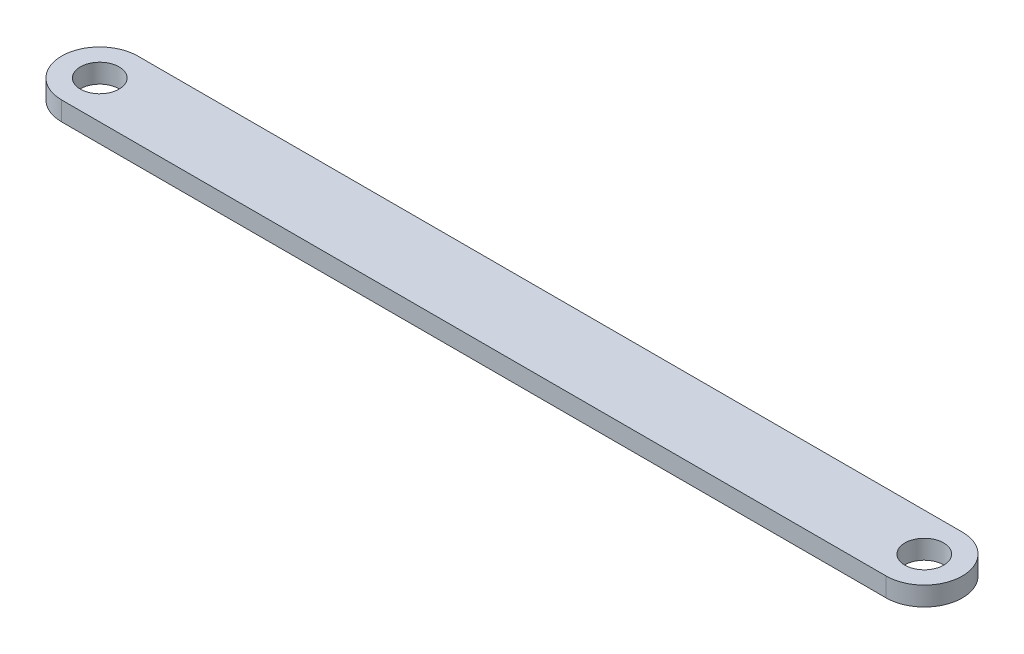
ISO-10303-21;
HEADER;
FILE_DESCRIPTION(('STEP AP214'),'2;1');
FILE_NAME('part.step','',(''),(''),'','','');
FILE_SCHEMA(('AUTOMOTIVE_DESIGN { 1 0 10303 214 1 1 1 1 }'));
ENDSEC;
DATA;
#1=APPLICATION_CONTEXT('core data for automotive mechanical design processes');
#2=APPLICATION_PROTOCOL_DEFINITION('international standard','automotive_design',2000,#1);
#3=PRODUCT_CONTEXT('',#1,'mechanical');
#4=PRODUCT('Part','Part','',(#3));
#5=PRODUCT_RELATED_PRODUCT_CATEGORY('part','',(#4));
#6=PRODUCT_DEFINITION_FORMATION('','',#4);
#7=PRODUCT_DEFINITION_CONTEXT('part definition',#1,'design');
#8=PRODUCT_DEFINITION('design','',#6,#7);
#9=PRODUCT_DEFINITION_SHAPE('','',#8);
#10=(LENGTH_UNIT() NAMED_UNIT(*) SI_UNIT(.MILLI.,.METRE.));
#11=(NAMED_UNIT(*) PLANE_ANGLE_UNIT() SI_UNIT($,.RADIAN.));
#12=(NAMED_UNIT(*) SI_UNIT($,.STERADIAN.) SOLID_ANGLE_UNIT());
#13=UNCERTAINTY_MEASURE_WITH_UNIT(LENGTH_MEASURE(1.E-05),#10,'distance_accuracy_value','');
#14=(GEOMETRIC_REPRESENTATION_CONTEXT(3) GLOBAL_UNCERTAINTY_ASSIGNED_CONTEXT((#13)) GLOBAL_UNIT_ASSIGNED_CONTEXT((#10,
#11,#12)) REPRESENTATION_CONTEXT('',''));
#15=CARTESIAN_POINT('',(0.,0.,0.));
#16=DIRECTION('',(0.,0.,1.));
#17=DIRECTION('',(1.,0.,0.));
#18=AXIS2_PLACEMENT_3D('',#15,#16,#17);
#19=CARTESIAN_POINT('',(0.,3.,0.));
#20=DIRECTION('',(0.,1.,0.));
#21=DIRECTION('',(0.,0.,1.));
#22=AXIS2_PLACEMENT_3D('',#19,#20,#21);
#23=PLANE('',#22);
#24=CARTESIAN_POINT('',(0.,3.,0.));
#25=DIRECTION('',(0.,1.,0.));
#26=DIRECTION('',(0.,0.,1.));
#27=AXIS2_PLACEMENT_3D('',#24,#25,#26);
#28=CIRCLE('',#27,3.05);
#29=CARTESIAN_POINT('',(0.,3.,3.05));
#30=VERTEX_POINT('',#29);
#31=EDGE_CURVE('E108',#30,#30,#28,.T.);
#32=ORIENTED_EDGE('',*,*,#31,.F.);
#33=EDGE_LOOP('',(#32));
#34=FACE_BOUND('',#33,.T.);
#35=CARTESIAN_POINT('',(0.,3.,0.));
#36=DIRECTION('',(0.,1.,0.));
#37=DIRECTION('',(0.,0.,1.));
#38=AXIS2_PLACEMENT_3D('',#35,#36,#37);
#39=CIRCLE('',#38,6.);
#40=CARTESIAN_POINT('',(0.,3.,-6.));
#41=VERTEX_POINT('',#40);
#42=CARTESIAN_POINT('',(0.,3.,6.));
#43=VERTEX_POINT('',#42);
#44=EDGE_CURVE('E93',#41,#43,#39,.T.);
#45=ORIENTED_EDGE('',*,*,#44,.T.);
#46=DIRECTION('',(1.,0.,0.));
#47=VECTOR('',#46,1.);
#48=CARTESIAN_POINT('',(0.,3.,6.));
#49=LINE('',#48,#47);
#50=CARTESIAN_POINT('',(130.,3.,6.));
#51=VERTEX_POINT('',#50);
#52=EDGE_CURVE('E88',#43,#51,#49,.T.);
#53=ORIENTED_EDGE('',*,*,#52,.T.);
#54=CARTESIAN_POINT('',(130.,3.,0.));
#55=DIRECTION('',(0.,1.,0.));
#56=DIRECTION('',(0.,0.,1.));
#57=AXIS2_PLACEMENT_3D('',#54,#55,#56);
#58=CIRCLE('',#57,6.);
#59=CARTESIAN_POINT('',(130.,3.,-6.));
#60=VERTEX_POINT('',#59);
#61=EDGE_CURVE('E91',#51,#60,#58,.T.);
#62=ORIENTED_EDGE('',*,*,#61,.T.);
#63=DIRECTION('',(-1.,0.,0.));
#64=VECTOR('',#63,1.);
#65=CARTESIAN_POINT('',(0.,3.,-6.));
#66=LINE('',#65,#64);
#67=EDGE_CURVE('E58',#60,#41,#66,.T.);
#68=ORIENTED_EDGE('',*,*,#67,.T.);
#69=EDGE_LOOP('',(#45,#53,#62,#68));
#70=FACE_BOUND('',#69,.T.);
#71=CARTESIAN_POINT('',(130.,3.,0.));
#72=DIRECTION('',(0.,1.,0.));
#73=DIRECTION('',(0.,0.,1.));
#74=AXIS2_PLACEMENT_3D('',#71,#72,#73);
#75=CIRCLE('',#74,3.04999999999999);
#76=CARTESIAN_POINT('',(130.,3.,3.04999999999999));
#77=VERTEX_POINT('',#76);
#78=EDGE_CURVE('E123',#77,#77,#75,.T.);
#79=ORIENTED_EDGE('',*,*,#78,.F.);
#80=EDGE_LOOP('',(#79));
#81=FACE_BOUND('',#80,.T.);
#82=ADVANCED_FACE('F41',(#34,#70,#81),#23,.T.);
#83=CARTESIAN_POINT('',(0.,0.,0.));
#84=DIRECTION('',(0.,1.,0.));
#85=DIRECTION('',(0.,0.,1.));
#86=AXIS2_PLACEMENT_3D('',#83,#84,#85);
#87=PLANE('',#86);
#88=CARTESIAN_POINT('',(0.,0.,0.));
#89=DIRECTION('',(0.,1.,0.));
#90=DIRECTION('',(0.,0.,1.));
#91=AXIS2_PLACEMENT_3D('',#88,#89,#90);
#92=CIRCLE('',#91,6.);
#93=CARTESIAN_POINT('',(0.,0.,-6.));
#94=VERTEX_POINT('',#93);
#95=CARTESIAN_POINT('',(0.,0.,6.));
#96=VERTEX_POINT('',#95);
#97=EDGE_CURVE('E105',#94,#96,#92,.T.);
#98=ORIENTED_EDGE('',*,*,#97,.F.);
#99=DIRECTION('',(-1.,0.,0.));
#100=VECTOR('',#99,1.);
#101=CARTESIAN_POINT('',(0.,0.,-6.));
#102=LINE('',#101,#100);
#103=CARTESIAN_POINT('',(130.,0.,-6.));
#104=VERTEX_POINT('',#103);
#105=EDGE_CURVE('E81',#104,#94,#102,.T.);
#106=ORIENTED_EDGE('',*,*,#105,.F.);
#107=CARTESIAN_POINT('',(130.,0.,0.));
#108=DIRECTION('',(0.,1.,0.));
#109=DIRECTION('',(0.,0.,1.));
#110=AXIS2_PLACEMENT_3D('',#107,#108,#109);
#111=CIRCLE('',#110,6.);
#112=CARTESIAN_POINT('',(130.,0.,6.));
#113=VERTEX_POINT('',#112);
#114=EDGE_CURVE('E75',#113,#104,#111,.T.);
#115=ORIENTED_EDGE('',*,*,#114,.F.);
#116=DIRECTION('',(1.,0.,0.));
#117=VECTOR('',#116,1.);
#118=CARTESIAN_POINT('',(0.,0.,6.));
#119=LINE('',#118,#117);
#120=EDGE_CURVE('E97',#96,#113,#119,.T.);
#121=ORIENTED_EDGE('',*,*,#120,.F.);
#122=EDGE_LOOP('',(#98,#106,#115,#121));
#123=FACE_BOUND('',#122,.T.);
#124=CARTESIAN_POINT('',(0.,0.,0.));
#125=DIRECTION('',(0.,1.,0.));
#126=DIRECTION('',(0.,0.,1.));
#127=AXIS2_PLACEMENT_3D('',#124,#125,#126);
#128=CIRCLE('',#127,3.05);
#129=CARTESIAN_POINT('',(0.,0.,3.05));
#130=VERTEX_POINT('',#129);
#131=EDGE_CURVE('E120',#130,#130,#128,.T.);
#132=ORIENTED_EDGE('',*,*,#131,.T.);
#133=EDGE_LOOP('',(#132));
#134=FACE_BOUND('',#133,.T.);
#135=CARTESIAN_POINT('',(130.,0.,0.));
#136=DIRECTION('',(0.,1.,0.));
#137=DIRECTION('',(0.,0.,1.));
#138=AXIS2_PLACEMENT_3D('',#135,#136,#137);
#139=CIRCLE('',#138,3.04999999999999);
#140=CARTESIAN_POINT('',(130.,0.,3.04999999999999));
#141=VERTEX_POINT('',#140);
#142=EDGE_CURVE('E126',#141,#141,#139,.T.);
#143=ORIENTED_EDGE('',*,*,#142,.T.);
#144=EDGE_LOOP('',(#143));
#145=FACE_BOUND('',#144,.T.);
#146=ADVANCED_FACE('F116',(#123,#134,#145),#87,.F.);
#147=CARTESIAN_POINT('',(0.,3.,0.));
#148=DIRECTION('',(0.,-1.,0.));
#149=DIRECTION('',(0.,0.,-1.));
#150=AXIS2_PLACEMENT_3D('',#147,#148,#149);
#151=CYLINDRICAL_SURFACE('',#150,6.);
#152=ORIENTED_EDGE('',*,*,#97,.T.);
#153=DIRECTION('',(0.,-1.,0.));
#154=VECTOR('',#153,1.);
#155=CARTESIAN_POINT('',(0.,3.,6.));
#156=LINE('',#155,#154);
#157=EDGE_CURVE('E11',#43,#96,#156,.T.);
#158=ORIENTED_EDGE('',*,*,#157,.F.);
#159=ORIENTED_EDGE('',*,*,#44,.F.);
#160=DIRECTION('',(0.,-1.,0.));
#161=VECTOR('',#160,1.);
#162=CARTESIAN_POINT('',(0.,3.,-6.));
#163=LINE('',#162,#161);
#164=EDGE_CURVE('E101',#41,#94,#163,.T.);
#165=ORIENTED_EDGE('',*,*,#164,.T.);
#166=EDGE_LOOP('',(#152,#158,#159,#165));
#167=FACE_BOUND('',#166,.T.);
#168=ADVANCED_FACE('F43',(#167),#151,.T.);
#169=CARTESIAN_POINT('',(0.,3.,6.));
#170=DIRECTION('',(0.,0.,-1.));
#171=DIRECTION('',(-1.,0.,0.));
#172=AXIS2_PLACEMENT_3D('',#169,#170,#171);
#173=PLANE('',#172);
#174=ORIENTED_EDGE('',*,*,#120,.T.);
#175=DIRECTION('',(0.,-1.,0.));
#176=VECTOR('',#175,1.);
#177=CARTESIAN_POINT('',(130.,3.,6.));
#178=LINE('',#177,#176);
#179=EDGE_CURVE('E50',#51,#113,#178,.T.);
#180=ORIENTED_EDGE('',*,*,#179,.F.);
#181=ORIENTED_EDGE('',*,*,#52,.F.);
#182=ORIENTED_EDGE('',*,*,#157,.T.);
#183=EDGE_LOOP('',(#174,#180,#181,#182));
#184=FACE_BOUND('',#183,.T.);
#185=ADVANCED_FACE('F96',(#184),#173,.F.);
#186=CARTESIAN_POINT('',(130.,3.,0.));
#187=DIRECTION('',(0.,-1.,0.));
#188=DIRECTION('',(0.,0.,-1.));
#189=AXIS2_PLACEMENT_3D('',#186,#187,#188);
#190=CYLINDRICAL_SURFACE('',#189,6.);
#191=ORIENTED_EDGE('',*,*,#114,.T.);
#192=DIRECTION('',(0.,-1.,0.));
#193=VECTOR('',#192,1.);
#194=CARTESIAN_POINT('',(130.,3.,-6.));
#195=LINE('',#194,#193);
#196=EDGE_CURVE('E98',#60,#104,#195,.T.);
#197=ORIENTED_EDGE('',*,*,#196,.F.);
#198=ORIENTED_EDGE('',*,*,#61,.F.);
#199=ORIENTED_EDGE('',*,*,#179,.T.);
#200=EDGE_LOOP('',(#191,#197,#198,#199));
#201=FACE_BOUND('',#200,.T.);
#202=ADVANCED_FACE('F99',(#201),#190,.T.);
#203=CARTESIAN_POINT('',(0.,3.,-6.));
#204=DIRECTION('',(0.,0.,1.));
#205=DIRECTION('',(1.,0.,0.));
#206=AXIS2_PLACEMENT_3D('',#203,#204,#205);
#207=PLANE('',#206);
#208=ORIENTED_EDGE('',*,*,#105,.T.);
#209=ORIENTED_EDGE('',*,*,#164,.F.);
#210=ORIENTED_EDGE('',*,*,#67,.F.);
#211=ORIENTED_EDGE('',*,*,#196,.T.);
#212=EDGE_LOOP('',(#208,#209,#210,#211));
#213=FACE_BOUND('',#212,.T.);
#214=ADVANCED_FACE('F113',(#213),#207,.F.);
#215=CARTESIAN_POINT('',(0.,3.,0.));
#216=DIRECTION('',(0.,-1.,0.));
#217=DIRECTION('',(0.,0.,-1.));
#218=AXIS2_PLACEMENT_3D('',#215,#216,#217);
#219=CYLINDRICAL_SURFACE('',#218,3.05);
#220=ORIENTED_EDGE('',*,*,#31,.T.);
#221=EDGE_LOOP('',(#220));
#222=FACE_BOUND('',#221,.T.);
#223=ORIENTED_EDGE('',*,*,#131,.F.);
#224=EDGE_LOOP('',(#223));
#225=FACE_BOUND('',#224,.T.);
#226=ADVANCED_FACE('F143',(#222,#225),#219,.F.);
#227=CARTESIAN_POINT('',(130.,3.,0.));
#228=DIRECTION('',(0.,-1.,0.));
#229=DIRECTION('',(0.,0.,-1.));
#230=AXIS2_PLACEMENT_3D('',#227,#228,#229);
#231=CYLINDRICAL_SURFACE('',#230,3.04999999999999);
#232=ORIENTED_EDGE('',*,*,#78,.T.);
#233=EDGE_LOOP('',(#232));
#234=FACE_BOUND('',#233,.T.);
#235=ORIENTED_EDGE('',*,*,#142,.F.);
#236=EDGE_LOOP('',(#235));
#237=FACE_BOUND('',#236,.T.);
#238=ADVANCED_FACE('F132',(#234,#237),#231,.F.);
#239=CLOSED_SHELL('',(#82,#146,#168,#185,#202,#214,#226,#238));
#240=MANIFOLD_SOLID_BREP('B2',#239);
#241=ADVANCED_BREP_SHAPE_REPRESENTATION('',(#18,#240),#14);
#242=SHAPE_DEFINITION_REPRESENTATION(#9,#241);
ENDSEC;
END-ISO-10303-21;
